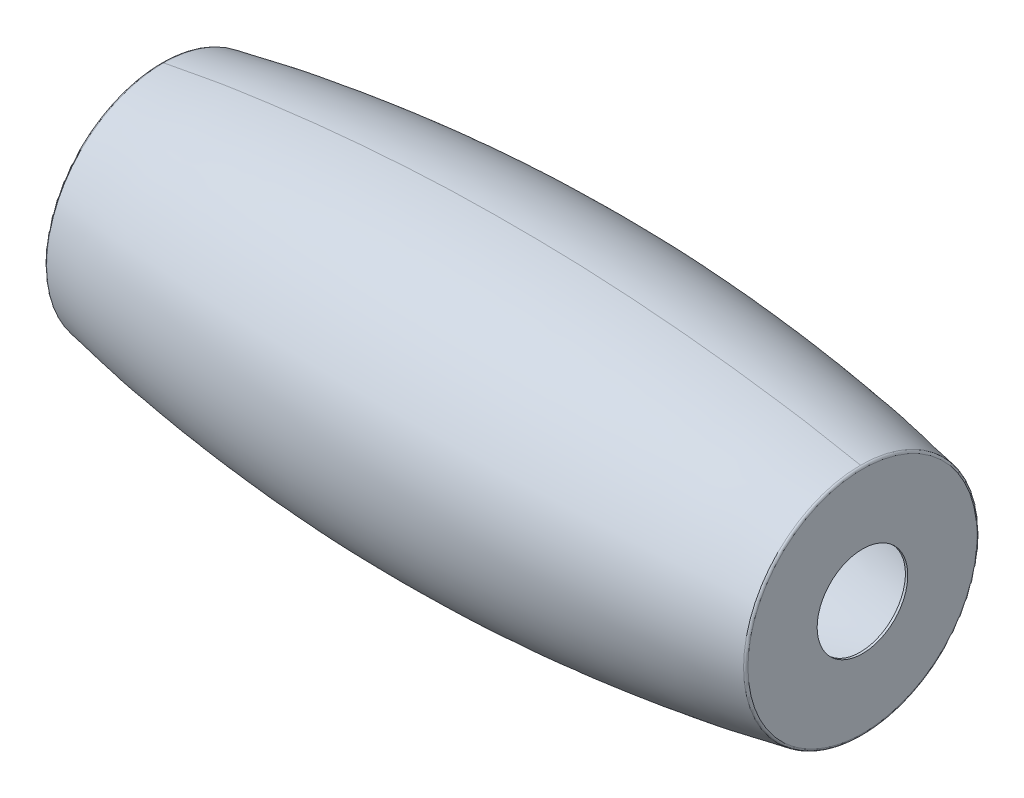
ISO-10303-21;
HEADER;
FILE_DESCRIPTION(('STEP AP214'),'2;1');
FILE_NAME('part.step','',(''),(''),'','','');
FILE_SCHEMA(('AUTOMOTIVE_DESIGN { 1 0 10303 214 1 1 1 1 }'));
ENDSEC;
DATA;
#1=APPLICATION_CONTEXT('core data for automotive mechanical design processes');
#2=APPLICATION_PROTOCOL_DEFINITION('international standard','automotive_design',2000,#1);
#3=PRODUCT_CONTEXT('',#1,'mechanical');
#4=PRODUCT('Part','Part','',(#3));
#5=PRODUCT_RELATED_PRODUCT_CATEGORY('part','',(#4));
#6=PRODUCT_DEFINITION_FORMATION('','',#4);
#7=PRODUCT_DEFINITION_CONTEXT('part definition',#1,'design');
#8=PRODUCT_DEFINITION('design','',#6,#7);
#9=PRODUCT_DEFINITION_SHAPE('','',#8);
#10=(LENGTH_UNIT() NAMED_UNIT(*) SI_UNIT(.MILLI.,.METRE.));
#11=(NAMED_UNIT(*) PLANE_ANGLE_UNIT() SI_UNIT($,.RADIAN.));
#12=(NAMED_UNIT(*) SI_UNIT($,.STERADIAN.) SOLID_ANGLE_UNIT());
#13=UNCERTAINTY_MEASURE_WITH_UNIT(LENGTH_MEASURE(1.E-05),#10,'distance_accuracy_value','');
#14=(GEOMETRIC_REPRESENTATION_CONTEXT(3) GLOBAL_UNCERTAINTY_ASSIGNED_CONTEXT((#13)) GLOBAL_UNIT_ASSIGNED_CONTEXT((#10,
#11,#12)) REPRESENTATION_CONTEXT('',''));
#15=CARTESIAN_POINT('',(0.,0.,0.));
#16=DIRECTION('',(0.,0.,1.));
#17=DIRECTION('',(1.,0.,0.));
#18=AXIS2_PLACEMENT_3D('',#15,#16,#17);
#19=CARTESIAN_POINT('',(36.322,0.,0.));
#20=DIRECTION('',(1.,0.,0.));
#21=DIRECTION('',(0.,1.,0.));
#22=AXIS2_PLACEMENT_3D('',#19,#20,#21);
#23=TOROIDAL_SURFACE('',#22,6.24835214318298,0.254);
#24=CARTESIAN_POINT('',(36.576,0.,0.));
#25=DIRECTION('',(1.,0.,0.));
#26=DIRECTION('',(0.,-1.,0.));
#27=AXIS2_PLACEMENT_3D('',#24,#25,#26);
#28=CIRCLE('',#27,6.24835214318298);
#29=CARTESIAN_POINT('',(36.576,-6.24835214318297,0.));
#30=VERTEX_POINT('',#29);
#31=CARTESIAN_POINT('',(36.576,6.24835214318299,0.));
#32=VERTEX_POINT('',#31);
#33=EDGE_CURVE('E65',#30,#32,#28,.T.);
#34=ORIENTED_EDGE('',*,*,#33,.T.);
#35=CARTESIAN_POINT('',(36.576,0.,0.));
#36=DIRECTION('',(1.,0.,0.));
#37=DIRECTION('',(0.,1.,0.));
#38=AXIS2_PLACEMENT_3D('',#35,#36,#37);
#39=CIRCLE('',#38,6.24835214318298);
#40=EDGE_CURVE('E68',#32,#30,#39,.T.);
#41=ORIENTED_EDGE('',*,*,#40,.T.);
#42=EDGE_LOOP('',(#34,#41));
#43=FACE_BOUND('',#42,.T.);
#44=CARTESIAN_POINT('',(36.404592427617,0.,0.));
#45=DIRECTION('',(1.,0.,0.));
#46=DIRECTION('',(0.,1.,0.));
#47=AXIS2_PLACEMENT_3D('',#44,#45,#46);
#48=CIRCLE('',#47,6.48854891855754);
#49=CARTESIAN_POINT('',(36.404592427617,6.48854891855755,0.));
#50=VERTEX_POINT('',#49);
#51=EDGE_CURVE('E72',#50,#50,#48,.F.);
#52=ORIENTED_EDGE('',*,*,#51,.T.);
#53=EDGE_LOOP('',(#52));
#54=FACE_BOUND('',#53,.T.);
#55=ADVANCED_FACE('F17',(#43,#54),#23,.F.);
#56=CARTESIAN_POINT('',(36.576,0.,0.));
#57=DIRECTION('',(1.,0.,0.));
#58=DIRECTION('',(0.,1.,0.));
#59=AXIS2_PLACEMENT_3D('',#56,#57,#58);
#60=PLANE('',#59);
#61=CARTESIAN_POINT('',(36.576,0.,0.));
#62=DIRECTION('',(-1.,0.,0.));
#63=DIRECTION('',(0.,0.,1.));
#64=AXIS2_PLACEMENT_3D('',#61,#62,#63);
#65=CIRCLE('',#64,4.7625);
#66=CARTESIAN_POINT('',(36.576,0.,4.7625));
#67=VERTEX_POINT('',#66);
#68=EDGE_CURVE('E95',#67,#67,#65,.F.);
#69=ORIENTED_EDGE('',*,*,#68,.T.);
#70=EDGE_LOOP('',(#69));
#71=FACE_BOUND('',#70,.T.);
#72=ORIENTED_EDGE('',*,*,#33,.F.);
#73=ORIENTED_EDGE('',*,*,#40,.F.);
#74=EDGE_LOOP('',(#72,#73));
#75=FACE_BOUND('',#74,.T.);
#76=ADVANCED_FACE('F70',(#71,#75),#60,.F.);
#77=CARTESIAN_POINT('',(-0.761999999999992,-101.6,0.));
#78=DIRECTION('',(0.,0.,1.));
#79=DIRECTION('',(0.,1.,0.));
#80=AXIS2_PLACEMENT_3D('',#77,#78,#79);
#81=CIRCLE('',#80,114.3);
#82=TRIMMED_CURVE('',#81,(PARAMETER_VALUE(-0.475882249660417)),
(PARAMETER_VALUE(0.475882249660417)),.T.,.PARAMETER.);
#83=CARTESIAN_POINT('',(-0.762000000000004,0.,0.));
#84=DIRECTION('',(1.,0.,0.));
#85=AXIS1_PLACEMENT('',#83,#84);
#86=SURFACE_OF_REVOLUTION('',#82,#85);
#87=ORIENTED_EDGE('',*,*,#51,.F.);
#88=EDGE_LOOP('',(#87));
#89=FACE_BOUND('',#88,.T.);
#90=CARTESIAN_POINT('',(-36.83,0.,0.));
#91=DIRECTION('',(1.,0.,0.));
#92=DIRECTION('',(0.,1.,0.));
#93=AXIS2_PLACEMENT_3D('',#90,#91,#92);
#94=CIRCLE('',#93,6.86008194723072);
#95=CARTESIAN_POINT('',(-36.83,6.86008194723071,0.));
#96=VERTEX_POINT('',#95);
#97=EDGE_CURVE('E92',#96,#96,#94,.T.);
#98=ORIENTED_EDGE('',*,*,#97,.F.);
#99=EDGE_LOOP('',(#98));
#100=FACE_BOUND('',#99,.T.);
#101=ADVANCED_FACE('F178',(#89,#100),#86,.T.);
#102=CARTESIAN_POINT('',(38.1,0.,0.));
#103=DIRECTION('',(-1.,0.,0.));
#104=DIRECTION('',(0.,0.,1.));
#105=AXIS2_PLACEMENT_3D('',#102,#103,#104);
#106=CYLINDRICAL_SURFACE('',#105,4.7625);
#107=ORIENTED_EDGE('',*,*,#68,.F.);
#108=EDGE_LOOP('',(#107));
#109=FACE_BOUND('',#108,.T.);
#110=CARTESIAN_POINT('',(36.83,0.,0.));
#111=DIRECTION('',(-1.,0.,0.));
#112=DIRECTION('',(0.,0.,1.));
#113=AXIS2_PLACEMENT_3D('',#110,#111,#112);
#114=CIRCLE('',#113,4.7625);
#115=CARTESIAN_POINT('',(36.83,0.,4.7625));
#116=VERTEX_POINT('',#115);
#117=EDGE_CURVE('E83',#116,#116,#114,.T.);
#118=ORIENTED_EDGE('',*,*,#117,.F.);
#119=EDGE_LOOP('',(#118));
#120=FACE_BOUND('',#119,.T.);
#121=ADVANCED_FACE('F181',(#109,#120),#106,.F.);
#122=CARTESIAN_POINT('',(-36.83,0.,0.));
#123=DIRECTION('',(-1.,0.,0.));
#124=DIRECTION('',(0.,0.,1.));
#125=AXIS2_PLACEMENT_3D('',#122,#123,#124);
#126=PLANE('',#125);
#127=ORIENTED_EDGE('',*,*,#97,.T.);
#128=EDGE_LOOP('',(#127));
#129=FACE_BOUND('',#128,.T.);
#130=CARTESIAN_POINT('',(-36.83,0.,0.));
#131=DIRECTION('',(1.,0.,0.));
#132=DIRECTION('',(0.,0.,-1.));
#133=AXIS2_PLACEMENT_3D('',#130,#131,#132);
#134=CIRCLE('',#133,12.0362964271716);
#135=CARTESIAN_POINT('',(-36.83,0.,-12.0362964271716));
#136=VERTEX_POINT('',#135);
#137=CARTESIAN_POINT('',(-36.83,0.,12.0362964271716));
#138=VERTEX_POINT('',#137);
#139=EDGE_CURVE('E205',#136,#138,#134,.T.);
#140=ORIENTED_EDGE('',*,*,#139,.F.);
#141=CARTESIAN_POINT('',(-36.83,0.,0.));
#142=DIRECTION('',(1.,0.,0.));
#143=DIRECTION('',(0.,0.,1.));
#144=AXIS2_PLACEMENT_3D('',#141,#142,#143);
#145=CIRCLE('',#144,12.0362964271716);
#146=EDGE_CURVE('E169',#138,#136,#145,.T.);
#147=ORIENTED_EDGE('',*,*,#146,.F.);
#148=EDGE_LOOP('',(#140,#147));
#149=FACE_BOUND('',#148,.T.);
#150=ADVANCED_FACE('F201',(#129,#149),#126,.T.);
#151=CARTESIAN_POINT('',(36.83,0.,0.));
#152=DIRECTION('',(1.,0.,0.));
#153=DIRECTION('',(0.,0.,-1.));
#154=AXIS2_PLACEMENT_3D('',#151,#152,#153);
#155=PLANE('',#154);
#156=ORIENTED_EDGE('',*,*,#117,.T.);
#157=EDGE_LOOP('',(#156));
#158=FACE_BOUND('',#157,.T.);
#159=CARTESIAN_POINT('',(36.83,0.,0.));
#160=DIRECTION('',(-1.,0.,0.));
#161=DIRECTION('',(0.,0.,-1.));
#162=AXIS2_PLACEMENT_3D('',#159,#160,#161);
#163=CIRCLE('',#162,12.0362964271716);
#164=CARTESIAN_POINT('',(36.83,0.,-12.0362964271716));
#165=VERTEX_POINT('',#164);
#166=CARTESIAN_POINT('',(36.83,0.,12.0362964271716));
#167=VERTEX_POINT('',#166);
#168=EDGE_CURVE('E135',#165,#167,#163,.T.);
#169=ORIENTED_EDGE('',*,*,#168,.F.);
#170=CARTESIAN_POINT('',(36.83,0.,0.));
#171=DIRECTION('',(-1.,0.,0.));
#172=DIRECTION('',(0.,0.,1.));
#173=AXIS2_PLACEMENT_3D('',#170,#171,#172);
#174=CIRCLE('',#173,12.0362964271716);
#175=EDGE_CURVE('E91',#167,#165,#174,.T.);
#176=ORIENTED_EDGE('',*,*,#175,.F.);
#177=EDGE_LOOP('',(#169,#176));
#178=FACE_BOUND('',#177,.T.);
#179=ADVANCED_FACE('F143',(#158,#178),#155,.T.);
#180=CARTESIAN_POINT('',(-36.576,0.,0.));
#181=DIRECTION('',(-1.,0.,0.));
#182=DIRECTION('',(0.,0.,1.));
#183=AXIS2_PLACEMENT_3D('',#180,#181,#182);
#184=TOROIDAL_SURFACE('',#183,12.0362964271716,0.254);
#185=CARTESIAN_POINT('',(-36.6206256312143,0.,0.));
#186=DIRECTION('',(-1.,0.,0.));
#187=DIRECTION('',(0.,0.,1.));
#188=AXIS2_PLACEMENT_3D('',#185,#186,#187);
#189=CIRCLE('',#188,12.2863455284272);
#190=CARTESIAN_POINT('',(-36.6206256312143,12.2863455284272,0.));
#191=VERTEX_POINT('',#190);
#192=CARTESIAN_POINT('',(-36.6206256312143,-12.2863455284272,0.));
#193=VERTEX_POINT('',#192);
#194=EDGE_CURVE('E29',#191,#193,#189,.T.);
#195=ORIENTED_EDGE('',*,*,#194,.T.);
#196=CARTESIAN_POINT('',(-36.6206256312143,0.,0.));
#197=DIRECTION('',(-1.,0.,0.));
#198=DIRECTION('',(0.,0.,1.));
#199=AXIS2_PLACEMENT_3D('',#196,#197,#198);
#200=CIRCLE('',#199,12.2863455284272);
#201=EDGE_CURVE('E162',#193,#191,#200,.T.);
#202=ORIENTED_EDGE('',*,*,#201,.T.);
#203=EDGE_LOOP('',(#195,#202));
#204=FACE_BOUND('',#203,.T.);
#205=ORIENTED_EDGE('',*,*,#146,.T.);
#206=ORIENTED_EDGE('',*,*,#139,.T.);
#207=EDGE_LOOP('',(#205,#206));
#208=FACE_BOUND('',#207,.T.);
#209=ADVANCED_FACE('F139',(#204,#208),#184,.T.);
#210=CARTESIAN_POINT('',(36.6206256312143,-12.2863455284272,0.));
#211=CARTESIAN_POINT('',(36.6206256312143,-12.2863455284272,24.5726910568543));
#212=CARTESIAN_POINT('',(36.6206256312143,12.2863455284271,24.5726910568543));
#213=CARTESIAN_POINT('',(36.6206256312143,12.2863455284272,0.));
#214=CARTESIAN_POINT('',(36.1823400369662,-12.3645652508626,0.));
#215=CARTESIAN_POINT('',(36.1823400369662,-12.3645652508626,24.7291305017251));
#216=CARTESIAN_POINT('',(36.1823400369662,12.3645652508626,24.7291305017251));
#217=CARTESIAN_POINT('',(36.1823400369662,12.3645652508626,0.));
#218=CARTESIAN_POINT('',(34.895189008316,-12.5919726852556,0.));
#219=CARTESIAN_POINT('',(34.895189008316,-12.5919726852556,25.1839453705113));
#220=CARTESIAN_POINT('',(34.895189008316,12.5919726852556,25.1839453705113));
#221=CARTESIAN_POINT('',(34.895189008316,12.5919726852556,0.));
#222=CARTESIAN_POINT('',(32.7682877990207,-13.0078658125191,0.));
#223=CARTESIAN_POINT('',(32.7682877990207,-13.0078658125191,26.0157316250382));
#224=CARTESIAN_POINT('',(32.7682877990207,13.0078658125191,26.0157316250382));
#225=CARTESIAN_POINT('',(32.7682877990207,13.0078658125191,0.));
#226=CARTESIAN_POINT('',(30.1498936214375,-13.498171470381,0.));
#227=CARTESIAN_POINT('',(30.1498936214375,-13.498171470381,26.996342940762));
#228=CARTESIAN_POINT('',(30.1498936214375,13.498171470381,26.996342940762));
#229=CARTESIAN_POINT('',(30.1498936214375,13.498171470381,0.));
#230=CARTESIAN_POINT('',(27.4652909380355,-13.8563965552137,0.));
#231=CARTESIAN_POINT('',(27.4652909380355,-13.8563965552137,27.7127931104274));
#232=CARTESIAN_POINT('',(27.4652909380355,13.8563965552137,27.7127931104275));
#233=CARTESIAN_POINT('',(27.4652909380355,13.8563965552137,0.));
#234=CARTESIAN_POINT('',(24.7436750485395,-14.262960466835,0.));
#235=CARTESIAN_POINT('',(24.7436750485395,-14.262960466835,28.5259209336699));
#236=CARTESIAN_POINT('',(24.7436750485395,14.262960466835,28.5259209336699));
#237=CARTESIAN_POINT('',(24.7436750485395,14.262960466835,0.));
#238=CARTESIAN_POINT('',(22.0316083077427,-14.5828305626849,0.));
#239=CARTESIAN_POINT('',(22.0316083077427,-14.5828305626849,29.1656611253699));
#240=CARTESIAN_POINT('',(22.0316083077427,14.5828305626849,29.1656611253699));
#241=CARTESIAN_POINT('',(22.0316083077427,14.5828305626849,0.));
#242=CARTESIAN_POINT('',(19.3152565203882,-14.8947163257228,0.));
#243=CARTESIAN_POINT('',(19.3152565203882,-14.8947163257228,29.7894326514455));
#244=CARTESIAN_POINT('',(19.3152565203882,14.8947163257227,29.7894326514455));
#245=CARTESIAN_POINT('',(19.3152565203882,14.8947163257228,0.));
#246=CARTESIAN_POINT('',(16.5786256848154,-15.1399782037662,0.));
#247=CARTESIAN_POINT('',(16.5786256848154,-15.1399782037662,30.2799564075325));
#248=CARTESIAN_POINT('',(16.5786256848154,15.1399782037662,30.2799564075325));
#249=CARTESIAN_POINT('',(16.5786256848154,15.1399782037662,0.));
#250=CARTESIAN_POINT('',(13.8367643124234,-15.3802449571985,0.));
#251=CARTESIAN_POINT('',(13.8367643124234,-15.3802449571985,30.760489914397));
#252=CARTESIAN_POINT('',(13.8367643124234,15.3802449571985,30.760489914397));
#253=CARTESIAN_POINT('',(13.8367643124234,15.3802449571985,0.));
#254=CARTESIAN_POINT('',(11.0749110488003,-15.5453875119554,0.));
#255=CARTESIAN_POINT('',(11.0749110488003,-15.5453875119554,31.0907750239108));
#256=CARTESIAN_POINT('',(11.0749110488003,15.5453875119554,31.0907750239108));
#257=CARTESIAN_POINT('',(11.0749110488003,15.5453875119554,0.));
#258=CARTESIAN_POINT('',(8.30710209974984,-15.7071811580555,0.));
#259=CARTESIAN_POINT('',(8.30710209974984,-15.7071811580555,31.4143623161109));
#260=CARTESIAN_POINT('',(8.30710209974984,15.7071811580554,31.4143623161109));
#261=CARTESIAN_POINT('',(8.30710209974984,15.7071811580555,0.));
#262=CARTESIAN_POINT('',(5.53787452840192,-15.8087833135671,0.));
#263=CARTESIAN_POINT('',(5.53787452840192,-15.8087833135671,31.6175666271341));
#264=CARTESIAN_POINT('',(5.53787452840192,15.8087833135671,31.6175666271341));
#265=CARTESIAN_POINT('',(5.53787452840192,15.8087833135671,0.));
#266=CARTESIAN_POINT('',(2.76875168423245,-15.8503711155309,0.));
#267=CARTESIAN_POINT('',(2.76875168423245,-15.8503711155309,31.7007422310617));
#268=CARTESIAN_POINT('',(2.76875168423245,15.8503711155309,31.7007422310617));
#269=CARTESIAN_POINT('',(2.76875168423245,15.8503711155309,0.));
#270=CARTESIAN_POINT('',(0.,-15.8873136650366,0.));
#271=CARTESIAN_POINT('',(0.,-15.8873136650366,31.7746273300733));
#272=CARTESIAN_POINT('',(0.,15.8873136650366,31.7746273300733));
#273=CARTESIAN_POINT('',(0.,15.8873136650366,0.));
#274=CARTESIAN_POINT('',(-2.76875168423244,-15.8503711155309,0.));
#275=CARTESIAN_POINT('',(-2.76875168423244,-15.8503711155309,31.7007422310617));
#276=CARTESIAN_POINT('',(-2.76875168423244,15.8503711155309,31.7007422310617));
#277=CARTESIAN_POINT('',(-2.76875168423244,15.8503711155309,0.));
#278=CARTESIAN_POINT('',(-5.53787452840193,-15.8087833135671,0.));
#279=CARTESIAN_POINT('',(-5.53787452840193,-15.8087833135671,31.6175666271341));
#280=CARTESIAN_POINT('',(-5.53787452840193,15.8087833135671,31.6175666271341));
#281=CARTESIAN_POINT('',(-5.53787452840193,15.8087833135671,0.));
#282=CARTESIAN_POINT('',(-8.30710209974984,-15.7071811580555,0.));
#283=CARTESIAN_POINT('',(-8.30710209974984,-15.7071811580555,31.4143623161109));
#284=CARTESIAN_POINT('',(-8.30710209974984,15.7071811580554,31.4143623161109));
#285=CARTESIAN_POINT('',(-8.30710209974984,15.7071811580555,0.));
#286=CARTESIAN_POINT('',(-11.0749110488003,-15.5453875119554,0.));
#287=CARTESIAN_POINT('',(-11.0749110488003,-15.5453875119554,31.0907750239108));
#288=CARTESIAN_POINT('',(-11.0749110488003,15.5453875119554,31.0907750239108));
#289=CARTESIAN_POINT('',(-11.0749110488003,15.5453875119554,0.));
#290=CARTESIAN_POINT('',(-13.8367643124234,-15.3802449571985,0.));
#291=CARTESIAN_POINT('',(-13.8367643124234,-15.3802449571985,30.760489914397));
#292=CARTESIAN_POINT('',(-13.8367643124234,15.3802449571985,30.760489914397));
#293=CARTESIAN_POINT('',(-13.8367643124234,15.3802449571985,0.));
#294=CARTESIAN_POINT('',(-16.5786256848154,-15.1399782037662,0.));
#295=CARTESIAN_POINT('',(-16.5786256848154,-15.1399782037663,30.2799564075325));
#296=CARTESIAN_POINT('',(-16.5786256848154,15.1399782037662,30.2799564075325));
#297=CARTESIAN_POINT('',(-16.5786256848154,15.1399782037662,0.));
#298=CARTESIAN_POINT('',(-19.3152565203882,-14.8947163257228,0.));
#299=CARTESIAN_POINT('',(-19.3152565203882,-14.8947163257228,29.7894326514455));
#300=CARTESIAN_POINT('',(-19.3152565203882,14.8947163257227,29.7894326514455));
#301=CARTESIAN_POINT('',(-19.3152565203882,14.8947163257228,0.));
#302=CARTESIAN_POINT('',(-22.0316083077427,-14.5828305626849,0.));
#303=CARTESIAN_POINT('',(-22.0316083077427,-14.5828305626849,29.1656611253699));
#304=CARTESIAN_POINT('',(-22.0316083077427,14.5828305626849,29.1656611253699));
#305=CARTESIAN_POINT('',(-22.0316083077427,14.5828305626849,0.));
#306=CARTESIAN_POINT('',(-24.7436750485395,-14.262960466835,0.));
#307=CARTESIAN_POINT('',(-24.7436750485395,-14.262960466835,28.5259209336699));
#308=CARTESIAN_POINT('',(-24.7436750485395,14.2629604668349,28.5259209336699));
#309=CARTESIAN_POINT('',(-24.7436750485395,14.262960466835,0.));
#310=CARTESIAN_POINT('',(-27.4652909380355,-13.8563965552137,0.));
#311=CARTESIAN_POINT('',(-27.4652909380355,-13.8563965552137,27.7127931104275));
#312=CARTESIAN_POINT('',(-27.4652909380355,13.8563965552137,27.7127931104275));
#313=CARTESIAN_POINT('',(-27.4652909380355,13.8563965552137,0.));
#314=CARTESIAN_POINT('',(-30.1498936214375,-13.498171470381,0.));
#315=CARTESIAN_POINT('',(-30.1498936214375,-13.498171470381,26.996342940762));
#316=CARTESIAN_POINT('',(-30.1498936214375,13.498171470381,26.996342940762));
#317=CARTESIAN_POINT('',(-30.1498936214375,13.498171470381,0.));
#318=CARTESIAN_POINT('',(-32.7682877990207,-13.0078658125191,0.));
#319=CARTESIAN_POINT('',(-32.7682877990207,-13.0078658125191,26.0157316250382));
#320=CARTESIAN_POINT('',(-32.7682877990207,13.0078658125191,26.0157316250382));
#321=CARTESIAN_POINT('',(-32.7682877990207,13.0078658125191,0.));
#322=CARTESIAN_POINT('',(-34.895189008316,-12.5919726852557,0.));
#323=CARTESIAN_POINT('',(-34.895189008316,-12.5919726852557,25.1839453705113));
#324=CARTESIAN_POINT('',(-34.895189008316,12.5919726852556,25.1839453705113));
#325=CARTESIAN_POINT('',(-34.895189008316,12.5919726852557,0.));
#326=CARTESIAN_POINT('',(-36.1823400369662,-12.3645652508626,0.));
#327=CARTESIAN_POINT('',(-36.1823400369662,-12.3645652508626,24.7291305017251));
#328=CARTESIAN_POINT('',(-36.1823400369662,12.3645652508626,24.7291305017251));
#329=CARTESIAN_POINT('',(-36.1823400369662,12.3645652508626,0.));
#330=CARTESIAN_POINT('',(-36.6206256312143,-12.2863455284272,0.));
#331=CARTESIAN_POINT('',(-36.6206256312143,-12.2863455284272,24.5726910568543));
#332=CARTESIAN_POINT('',(-36.6206256312143,12.2863455284271,24.5726910568543));
#333=CARTESIAN_POINT('',(-36.6206256312143,12.2863455284272,0.));
#334=(BOUNDED_SURFACE() B_SPLINE_SURFACE(3,3,((#210,#211,#212,#213),(#214,#215,#216,#217),(#218,
#219,#220,#221),(#222,#223,#224,#225),(#226,#227,#228,#229),(#230,#231,#232,#233),(#234,#235,
#236,#237),(#238,#239,#240,#241),(#242,#243,#244,#245),(#246,#247,#248,#249),(#250,#251,#252,
#253),(#254,#255,#256,#257),(#258,#259,#260,#261),(#262,#263,#264,#265),(#266,#267,#268,#269),
(#270,#271,#272,#273),(#274,#275,#276,#277),(#278,#279,#280,#281),(#282,#283,#284,#285),(#286,
#287,#288,#289),(#290,#291,#292,#293),(#294,#295,#296,#297),(#298,#299,#300,#301),(#302,#303,
#304,#305),(#306,#307,#308,#309),(#310,#311,#312,#313),(#314,#315,#316,#317),(#318,#319,#320,
#321),(#322,#323,#324,#325),(#326,#327,#328,#329),(#330,#331,#332,#333)),.UNSPECIFIED.,.F.,.F.,
.F.) B_SPLINE_SURFACE_WITH_KNOTS((4,1,1,1,1,1,1,1,1,1,1,1,1,1,1,1,1,1,1,1,1,1,1,1,1,1,1,1,4),(4,
4),(0.265284915948771,0.273790766766706,0.290256508761379,0.30669282418853,0.324674055134799,
0.34199181548783,0.35926721557039,0.376845182434682,0.394229300381297,0.411760312088999,
0.429428853188004,0.447087765048057,0.464731852432814,0.482367039150761,0.5,0.517632960849239,
0.535268147567186,0.552912234951943,0.570571146811996,0.588239687911001,0.605770699618703,
0.623154817565318,0.64073278442961,0.65800818451217,0.675325944865201,0.693307175811471,
0.709743491238622,0.726209233233295,0.734715084051229),(0.,1.),
.UNSPECIFIED.) GEOMETRIC_REPRESENTATION_ITEM() RATIONAL_B_SPLINE_SURFACE(((1.,0.333333333333333,
0.333333333333333,1.),(1.,0.333333333333333,0.333333333333333,1.),(1.,0.333333333333333,
0.333333333333333,1.),(1.,0.333333333333333,0.333333333333333,1.),(1.,0.333333333333333,
0.333333333333333,1.),(1.,0.333333333333333,0.333333333333333,1.),(1.,0.333333333333333,
0.333333333333333,1.),(1.,0.333333333333333,0.333333333333333,1.),(1.,0.333333333333333,
0.333333333333333,1.),(1.,0.333333333333333,0.333333333333333,1.),(1.,0.333333333333333,
0.333333333333333,1.),(1.,0.333333333333333,0.333333333333333,1.),(1.,0.333333333333333,
0.333333333333333,1.),(1.,0.333333333333333,0.333333333333333,1.),(1.,0.333333333333333,
0.333333333333333,1.),(1.,0.333333333333333,0.333333333333333,1.),(1.,0.333333333333333,
0.333333333333333,1.),(1.,0.333333333333333,0.333333333333333,1.),(1.,0.333333333333333,
0.333333333333333,1.),(1.,0.333333333333333,0.333333333333333,1.),(1.,0.333333333333333,
0.333333333333333,1.),(1.,0.333333333333333,0.333333333333333,1.),(1.,0.333333333333333,
0.333333333333333,1.),(1.,0.333333333333333,0.333333333333333,1.),(1.,0.333333333333333,
0.333333333333333,1.),(1.,0.333333333333333,0.333333333333333,1.),(1.,0.333333333333333,
0.333333333333333,1.),(1.,0.333333333333333,0.333333333333333,1.),(1.,0.333333333333333,
0.333333333333333,1.),(1.,0.333333333333333,0.333333333333333,1.),(1.,0.333333333333333,
0.333333333333333,1.))) REPRESENTATION_ITEM('') SURFACE());
#335=CARTESIAN_POINT('',(36.6206256312143,0.,0.));
#336=DIRECTION('',(-1.,0.,0.));
#337=DIRECTION('',(0.,0.,1.));
#338=AXIS2_PLACEMENT_3D('',#335,#336,#337);
#339=CIRCLE('',#338,12.2863455284272);
#340=CARTESIAN_POINT('',(36.6206256312143,12.2863455284272,0.));
#341=VERTEX_POINT('',#340);
#342=CARTESIAN_POINT('',(36.6206256312143,-12.2863455284272,0.));
#343=VERTEX_POINT('',#342);
#344=EDGE_CURVE('E133',#341,#343,#339,.F.);
#345=CARTESIAN_POINT('',(36.6206256312143,12.2863455284272,0.));
#346=CARTESIAN_POINT('',(36.1823400369662,12.3645652508626,0.));
#347=CARTESIAN_POINT('',(34.895189008316,12.5919726852556,0.));
#348=CARTESIAN_POINT('',(32.7682877990207,13.0078658125191,0.));
#349=CARTESIAN_POINT('',(30.1498936214375,13.498171470381,0.));
#350=CARTESIAN_POINT('',(27.4652909380355,13.8563965552137,0.));
#351=CARTESIAN_POINT('',(24.7436750485395,14.262960466835,0.));
#352=CARTESIAN_POINT('',(22.0316083077427,14.5828305626849,0.));
#353=CARTESIAN_POINT('',(19.3152565203882,14.8947163257228,0.));
#354=CARTESIAN_POINT('',(16.5786256848154,15.1399782037662,0.));
#355=CARTESIAN_POINT('',(13.8367643124234,15.3802449571985,0.));
#356=CARTESIAN_POINT('',(11.0749110488003,15.5453875119554,0.));
#357=CARTESIAN_POINT('',(8.30710209974984,15.7071811580555,0.));
#358=CARTESIAN_POINT('',(5.53787452840192,15.8087833135671,0.));
#359=CARTESIAN_POINT('',(2.76875168423245,15.8503711155309,0.));
#360=CARTESIAN_POINT('',(0.,15.8873136650366,0.));
#361=CARTESIAN_POINT('',(-2.76875168423244,15.8503711155309,0.));
#362=CARTESIAN_POINT('',(-5.53787452840193,15.8087833135671,0.));
#363=CARTESIAN_POINT('',(-8.30710209974984,15.7071811580555,0.));
#364=CARTESIAN_POINT('',(-11.0749110488003,15.5453875119554,0.));
#365=CARTESIAN_POINT('',(-13.8367643124234,15.3802449571985,0.));
#366=CARTESIAN_POINT('',(-16.5786256848154,15.1399782037662,0.));
#367=CARTESIAN_POINT('',(-19.3152565203882,14.8947163257228,0.));
#368=CARTESIAN_POINT('',(-22.0316083077427,14.5828305626849,0.));
#369=CARTESIAN_POINT('',(-24.7436750485395,14.262960466835,0.));
#370=CARTESIAN_POINT('',(-27.4652909380355,13.8563965552137,0.));
#371=CARTESIAN_POINT('',(-30.1498936214375,13.498171470381,0.));
#372=CARTESIAN_POINT('',(-32.7682877990207,13.0078658125191,0.));
#373=CARTESIAN_POINT('',(-34.895189008316,12.5919726852557,0.));
#374=CARTESIAN_POINT('',(-36.1823400369662,12.3645652508626,0.));
#375=CARTESIAN_POINT('',(-36.6206256312143,12.2863455284272,0.));
#376=B_SPLINE_CURVE_WITH_KNOTS('',3,(#345,#346,#347,#348,#349,#350,#351,#352,#353,#354,#355,
#356,#357,#358,#359,#360,#361,#362,#363,#364,#365,#366,#367,#368,#369,#370,#371,#372,#373,#374,
#375),.UNSPECIFIED.,.F.,.F.,(4,1,1,1,1,1,1,1,1,1,1,1,1,1,1,1,1,1,1,1,1,1,1,1,1,1,1,1,4),
(0.265284915948771,0.273790766766706,0.290256508761379,0.30669282418853,0.324674055134799,
0.34199181548783,0.35926721557039,0.376845182434682,0.394229300381297,0.411760312088999,
0.429428853188004,0.447087765048057,0.464731852432814,0.482367039150761,0.5,0.517632960849239,
0.535268147567186,0.552912234951943,0.570571146811996,0.588239687911001,0.605770699618703,
0.623154817565318,0.64073278442961,0.65800818451217,0.675325944865201,0.693307175811471,
0.709743491238622,0.726209233233295,0.734715084051229),.UNSPECIFIED.);
#377=EDGE_CURVE('E130',#341,#191,#376,.T.);
#378=CARTESIAN_POINT('',(36.6206256312143,-12.2863455284272,0.));
#379=CARTESIAN_POINT('',(36.1823400369662,-12.3645652508626,0.));
#380=CARTESIAN_POINT('',(34.895189008316,-12.5919726852556,0.));
#381=CARTESIAN_POINT('',(32.7682877990207,-13.0078658125191,0.));
#382=CARTESIAN_POINT('',(30.1498936214375,-13.498171470381,0.));
#383=CARTESIAN_POINT('',(27.4652909380355,-13.8563965552137,0.));
#384=CARTESIAN_POINT('',(24.7436750485395,-14.262960466835,0.));
#385=CARTESIAN_POINT('',(22.0316083077427,-14.5828305626849,0.));
#386=CARTESIAN_POINT('',(19.3152565203882,-14.8947163257228,0.));
#387=CARTESIAN_POINT('',(16.5786256848154,-15.1399782037662,0.));
#388=CARTESIAN_POINT('',(13.8367643124234,-15.3802449571985,0.));
#389=CARTESIAN_POINT('',(11.0749110488003,-15.5453875119554,0.));
#390=CARTESIAN_POINT('',(8.30710209974984,-15.7071811580555,0.));
#391=CARTESIAN_POINT('',(5.53787452840192,-15.8087833135671,0.));
#392=CARTESIAN_POINT('',(2.76875168423245,-15.8503711155309,0.));
#393=CARTESIAN_POINT('',(0.,-15.8873136650366,0.));
#394=CARTESIAN_POINT('',(-2.76875168423244,-15.8503711155309,0.));
#395=CARTESIAN_POINT('',(-5.53787452840193,-15.8087833135671,0.));
#396=CARTESIAN_POINT('',(-8.30710209974984,-15.7071811580555,0.));
#397=CARTESIAN_POINT('',(-11.0749110488003,-15.5453875119554,0.));
#398=CARTESIAN_POINT('',(-13.8367643124234,-15.3802449571985,0.));
#399=CARTESIAN_POINT('',(-16.5786256848154,-15.1399782037662,0.));
#400=CARTESIAN_POINT('',(-19.3152565203882,-14.8947163257228,0.));
#401=CARTESIAN_POINT('',(-22.0316083077427,-14.5828305626849,0.));
#402=CARTESIAN_POINT('',(-24.7436750485395,-14.262960466835,0.));
#403=CARTESIAN_POINT('',(-27.4652909380355,-13.8563965552137,0.));
#404=CARTESIAN_POINT('',(-30.1498936214375,-13.498171470381,0.));
#405=CARTESIAN_POINT('',(-32.7682877990207,-13.0078658125191,0.));
#406=CARTESIAN_POINT('',(-34.895189008316,-12.5919726852557,0.));
#407=CARTESIAN_POINT('',(-36.1823400369662,-12.3645652508626,0.));
#408=CARTESIAN_POINT('',(-36.6206256312143,-12.2863455284272,0.));
#409=B_SPLINE_CURVE_WITH_KNOTS('',3,(#378,#379,#380,#381,#382,#383,#384,#385,#386,#387,#388,
#389,#390,#391,#392,#393,#394,#395,#396,#397,#398,#399,#400,#401,#402,#403,#404,#405,#406,#407,
#408),.UNSPECIFIED.,.F.,.F.,(4,1,1,1,1,1,1,1,1,1,1,1,1,1,1,1,1,1,1,1,1,1,1,1,1,1,1,1,4),
(0.265284915948771,0.273790766766706,0.290256508761379,0.30669282418853,0.324674055134799,
0.34199181548783,0.35926721557039,0.376845182434682,0.394229300381297,0.411760312088999,
0.429428853188004,0.447087765048057,0.464731852432814,0.482367039150761,0.5,0.517632960849239,
0.535268147567186,0.552912234951943,0.570571146811996,0.588239687911001,0.605770699618703,
0.623154817565318,0.64073278442961,0.65800818451217,0.675325944865201,0.693307175811471,
0.709743491238622,0.726209233233295,0.734715084051229),.UNSPECIFIED.);
#410=EDGE_CURVE('E11',#193,#343,#409,.F.);
#411=ORIENTED_EDGE('',*,*,#344,.F.);
#412=ORIENTED_EDGE('',*,*,#377,.T.);
#413=ORIENTED_EDGE('',*,*,#201,.F.);
#414=ORIENTED_EDGE('',*,*,#410,.T.);
#415=EDGE_LOOP('',(#411,#412,#413,#414));
#416=FACE_BOUND('',#415,.T.);
#417=ADVANCED_FACE('F119',(#416),#334,.F.);
#418=CARTESIAN_POINT('',(36.576,0.,0.));
#419=DIRECTION('',(-1.,0.,0.));
#420=DIRECTION('',(0.,0.,1.));
#421=AXIS2_PLACEMENT_3D('',#418,#419,#420);
#422=TOROIDAL_SURFACE('',#421,12.0362964271716,0.254);
#423=ORIENTED_EDGE('',*,*,#175,.T.);
#424=ORIENTED_EDGE('',*,*,#168,.T.);
#425=EDGE_LOOP('',(#423,#424));
#426=FACE_BOUND('',#425,.T.);
#427=ORIENTED_EDGE('',*,*,#344,.T.);
#428=CARTESIAN_POINT('',(36.6206256312143,0.,0.));
#429=DIRECTION('',(1.,0.,0.));
#430=DIRECTION('',(0.,0.,-1.));
#431=AXIS2_PLACEMENT_3D('',#428,#429,#430);
#432=CIRCLE('',#431,12.2863455284272);
#433=EDGE_CURVE('E38',#343,#341,#432,.T.);
#434=ORIENTED_EDGE('',*,*,#433,.T.);
#435=EDGE_LOOP('',(#427,#434));
#436=FACE_BOUND('',#435,.T.);
#437=ADVANCED_FACE('F107',(#426,#436),#422,.T.);
#438=CARTESIAN_POINT('',(36.6206256312143,12.2863455284272,0.));
#439=CARTESIAN_POINT('',(36.6206256312143,12.2863455284272,-24.5726910568543));
#440=CARTESIAN_POINT('',(36.6206256312143,-12.2863455284271,-24.5726910568543));
#441=CARTESIAN_POINT('',(36.6206256312143,-12.2863455284272,0.));
#442=CARTESIAN_POINT('',(36.1823400369662,12.3645652508626,0.));
#443=CARTESIAN_POINT('',(36.1823400369662,12.3645652508626,-24.7291305017251));
#444=CARTESIAN_POINT('',(36.1823400369662,-12.3645652508626,-24.7291305017251));
#445=CARTESIAN_POINT('',(36.1823400369662,-12.3645652508626,0.));
#446=CARTESIAN_POINT('',(34.895189008316,12.5919726852556,0.));
#447=CARTESIAN_POINT('',(34.895189008316,12.5919726852556,-25.1839453705113));
#448=CARTESIAN_POINT('',(34.895189008316,-12.5919726852556,-25.1839453705113));
#449=CARTESIAN_POINT('',(34.895189008316,-12.5919726852556,0.));
#450=CARTESIAN_POINT('',(32.7682877990207,13.0078658125191,0.));
#451=CARTESIAN_POINT('',(32.7682877990207,13.0078658125191,-26.0157316250382));
#452=CARTESIAN_POINT('',(32.7682877990207,-13.0078658125191,-26.0157316250382));
#453=CARTESIAN_POINT('',(32.7682877990207,-13.0078658125191,0.));
#454=CARTESIAN_POINT('',(30.1498936214375,13.498171470381,0.));
#455=CARTESIAN_POINT('',(30.1498936214375,13.498171470381,-26.996342940762));
#456=CARTESIAN_POINT('',(30.1498936214375,-13.498171470381,-26.996342940762));
#457=CARTESIAN_POINT('',(30.1498936214375,-13.498171470381,0.));
#458=CARTESIAN_POINT('',(27.4652909380355,13.8563965552137,0.));
#459=CARTESIAN_POINT('',(27.4652909380355,13.8563965552137,-27.7127931104274));
#460=CARTESIAN_POINT('',(27.4652909380355,-13.8563965552137,-27.7127931104274));
#461=CARTESIAN_POINT('',(27.4652909380355,-13.8563965552137,0.));
#462=CARTESIAN_POINT('',(24.7436750485395,14.262960466835,0.));
#463=CARTESIAN_POINT('',(24.7436750485395,14.262960466835,-28.5259209336699));
#464=CARTESIAN_POINT('',(24.7436750485395,-14.262960466835,-28.5259209336699));
#465=CARTESIAN_POINT('',(24.7436750485395,-14.262960466835,0.));
#466=CARTESIAN_POINT('',(22.0316083077427,14.5828305626849,0.));
#467=CARTESIAN_POINT('',(22.0316083077427,14.5828305626849,-29.1656611253699));
#468=CARTESIAN_POINT('',(22.0316083077427,-14.5828305626849,-29.1656611253699));
#469=CARTESIAN_POINT('',(22.0316083077427,-14.5828305626849,0.));
#470=CARTESIAN_POINT('',(19.3152565203882,14.8947163257228,0.));
#471=CARTESIAN_POINT('',(19.3152565203882,14.8947163257228,-29.7894326514455));
#472=CARTESIAN_POINT('',(19.3152565203882,-14.8947163257227,-29.7894326514455));
#473=CARTESIAN_POINT('',(19.3152565203882,-14.8947163257228,0.));
#474=CARTESIAN_POINT('',(16.5786256848154,15.1399782037662,0.));
#475=CARTESIAN_POINT('',(16.5786256848154,15.1399782037662,-30.2799564075325));
#476=CARTESIAN_POINT('',(16.5786256848154,-15.1399782037662,-30.2799564075325));
#477=CARTESIAN_POINT('',(16.5786256848154,-15.1399782037662,0.));
#478=CARTESIAN_POINT('',(13.8367643124234,15.3802449571985,0.));
#479=CARTESIAN_POINT('',(13.8367643124234,15.3802449571985,-30.760489914397));
#480=CARTESIAN_POINT('',(13.8367643124234,-15.3802449571985,-30.760489914397));
#481=CARTESIAN_POINT('',(13.8367643124234,-15.3802449571985,0.));
#482=CARTESIAN_POINT('',(11.0749110488003,15.5453875119554,0.));
#483=CARTESIAN_POINT('',(11.0749110488003,15.5453875119554,-31.0907750239108));
#484=CARTESIAN_POINT('',(11.0749110488003,-15.5453875119554,-31.0907750239108));
#485=CARTESIAN_POINT('',(11.0749110488003,-15.5453875119554,0.));
#486=CARTESIAN_POINT('',(8.30710209974984,15.7071811580555,0.));
#487=CARTESIAN_POINT('',(8.30710209974984,15.7071811580555,-31.4143623161109));
#488=CARTESIAN_POINT('',(8.30710209974984,-15.7071811580554,-31.4143623161109));
#489=CARTESIAN_POINT('',(8.30710209974984,-15.7071811580555,0.));
#490=CARTESIAN_POINT('',(5.53787452840192,15.8087833135671,0.));
#491=CARTESIAN_POINT('',(5.53787452840192,15.8087833135671,-31.6175666271341));
#492=CARTESIAN_POINT('',(5.53787452840192,-15.8087833135671,-31.6175666271341));
#493=CARTESIAN_POINT('',(5.53787452840192,-15.8087833135671,0.));
#494=CARTESIAN_POINT('',(2.76875168423245,15.8503711155309,0.));
#495=CARTESIAN_POINT('',(2.76875168423245,15.8503711155309,-31.7007422310617));
#496=CARTESIAN_POINT('',(2.76875168423245,-15.8503711155309,-31.7007422310617));
#497=CARTESIAN_POINT('',(2.76875168423245,-15.8503711155309,0.));
#498=CARTESIAN_POINT('',(0.,15.8873136650366,0.));
#499=CARTESIAN_POINT('',(0.,15.8873136650366,-31.7746273300733));
#500=CARTESIAN_POINT('',(0.,-15.8873136650366,-31.7746273300733));
#501=CARTESIAN_POINT('',(0.,-15.8873136650366,0.));
#502=CARTESIAN_POINT('',(-2.76875168423244,15.8503711155309,0.));
#503=CARTESIAN_POINT('',(-2.76875168423244,15.8503711155309,-31.7007422310617));
#504=CARTESIAN_POINT('',(-2.76875168423244,-15.8503711155309,-31.7007422310617));
#505=CARTESIAN_POINT('',(-2.76875168423244,-15.8503711155309,0.));
#506=CARTESIAN_POINT('',(-5.53787452840193,15.8087833135671,0.));
#507=CARTESIAN_POINT('',(-5.53787452840193,15.8087833135671,-31.6175666271341));
#508=CARTESIAN_POINT('',(-5.53787452840193,-15.8087833135671,-31.6175666271341));
#509=CARTESIAN_POINT('',(-5.53787452840193,-15.8087833135671,0.));
#510=CARTESIAN_POINT('',(-8.30710209974984,15.7071811580555,0.));
#511=CARTESIAN_POINT('',(-8.30710209974984,15.7071811580555,-31.4143623161109));
#512=CARTESIAN_POINT('',(-8.30710209974984,-15.7071811580555,-31.4143623161109));
#513=CARTESIAN_POINT('',(-8.30710209974984,-15.7071811580555,0.));
#514=CARTESIAN_POINT('',(-11.0749110488003,15.5453875119554,0.));
#515=CARTESIAN_POINT('',(-11.0749110488003,15.5453875119554,-31.0907750239108));
#516=CARTESIAN_POINT('',(-11.0749110488003,-15.5453875119554,-31.0907750239108));
#517=CARTESIAN_POINT('',(-11.0749110488003,-15.5453875119554,0.));
#518=CARTESIAN_POINT('',(-13.8367643124234,15.3802449571985,0.));
#519=CARTESIAN_POINT('',(-13.8367643124234,15.3802449571985,-30.760489914397));
#520=CARTESIAN_POINT('',(-13.8367643124234,-15.3802449571985,-30.760489914397));
#521=CARTESIAN_POINT('',(-13.8367643124234,-15.3802449571985,0.));
#522=CARTESIAN_POINT('',(-16.5786256848154,15.1399782037662,0.));
#523=CARTESIAN_POINT('',(-16.5786256848154,15.1399782037662,-30.2799564075325));
#524=CARTESIAN_POINT('',(-16.5786256848154,-15.1399782037662,-30.2799564075325));
#525=CARTESIAN_POINT('',(-16.5786256848154,-15.1399782037662,0.));
#526=CARTESIAN_POINT('',(-19.3152565203882,14.8947163257228,0.));
#527=CARTESIAN_POINT('',(-19.3152565203882,14.8947163257228,-29.7894326514455));
#528=CARTESIAN_POINT('',(-19.3152565203882,-14.8947163257228,-29.7894326514455));
#529=CARTESIAN_POINT('',(-19.3152565203882,-14.8947163257228,0.));
#530=CARTESIAN_POINT('',(-22.0316083077427,14.5828305626849,0.));
#531=CARTESIAN_POINT('',(-22.0316083077427,14.5828305626849,-29.1656611253699));
#532=CARTESIAN_POINT('',(-22.0316083077427,-14.5828305626849,-29.1656611253699));
#533=CARTESIAN_POINT('',(-22.0316083077427,-14.5828305626849,0.));
#534=CARTESIAN_POINT('',(-24.7436750485395,14.262960466835,0.));
#535=CARTESIAN_POINT('',(-24.7436750485395,14.262960466835,-28.5259209336699));
#536=CARTESIAN_POINT('',(-24.7436750485395,-14.262960466835,-28.5259209336699));
#537=CARTESIAN_POINT('',(-24.7436750485395,-14.262960466835,0.));
#538=CARTESIAN_POINT('',(-27.4652909380355,13.8563965552137,0.));
#539=CARTESIAN_POINT('',(-27.4652909380355,13.8563965552137,-27.7127931104275));
#540=CARTESIAN_POINT('',(-27.4652909380355,-13.8563965552137,-27.7127931104275));
#541=CARTESIAN_POINT('',(-27.4652909380355,-13.8563965552137,0.));
#542=CARTESIAN_POINT('',(-30.1498936214375,13.498171470381,0.));
#543=CARTESIAN_POINT('',(-30.1498936214375,13.498171470381,-26.996342940762));
#544=CARTESIAN_POINT('',(-30.1498936214375,-13.498171470381,-26.996342940762));
#545=CARTESIAN_POINT('',(-30.1498936214375,-13.498171470381,0.));
#546=CARTESIAN_POINT('',(-32.7682877990207,13.0078658125191,0.));
#547=CARTESIAN_POINT('',(-32.7682877990207,13.0078658125191,-26.0157316250382));
#548=CARTESIAN_POINT('',(-32.7682877990207,-13.0078658125191,-26.0157316250382));
#549=CARTESIAN_POINT('',(-32.7682877990207,-13.0078658125191,0.));
#550=CARTESIAN_POINT('',(-34.895189008316,12.5919726852557,0.));
#551=CARTESIAN_POINT('',(-34.895189008316,12.5919726852557,-25.1839453705113));
#552=CARTESIAN_POINT('',(-34.895189008316,-12.5919726852556,-25.1839453705113));
#553=CARTESIAN_POINT('',(-34.895189008316,-12.5919726852557,0.));
#554=CARTESIAN_POINT('',(-36.1823400369662,12.3645652508626,0.));
#555=CARTESIAN_POINT('',(-36.1823400369662,12.3645652508626,-24.7291305017251));
#556=CARTESIAN_POINT('',(-36.1823400369662,-12.3645652508626,-24.7291305017251));
#557=CARTESIAN_POINT('',(-36.1823400369662,-12.3645652508626,0.));
#558=CARTESIAN_POINT('',(-36.6206256312143,12.2863455284272,0.));
#559=CARTESIAN_POINT('',(-36.6206256312143,12.2863455284272,-24.5726910568543));
#560=CARTESIAN_POINT('',(-36.6206256312143,-12.2863455284271,-24.5726910568543));
#561=CARTESIAN_POINT('',(-36.6206256312143,-12.2863455284272,0.));
#562=(BOUNDED_SURFACE() B_SPLINE_SURFACE(3,3,((#438,#439,#440,#441),(#442,#443,#444,#445),(#446,
#447,#448,#449),(#450,#451,#452,#453),(#454,#455,#456,#457),(#458,#459,#460,#461),(#462,#463,
#464,#465),(#466,#467,#468,#469),(#470,#471,#472,#473),(#474,#475,#476,#477),(#478,#479,#480,
#481),(#482,#483,#484,#485),(#486,#487,#488,#489),(#490,#491,#492,#493),(#494,#495,#496,#497),
(#498,#499,#500,#501),(#502,#503,#504,#505),(#506,#507,#508,#509),(#510,#511,#512,#513),(#514,
#515,#516,#517),(#518,#519,#520,#521),(#522,#523,#524,#525),(#526,#527,#528,#529),(#530,#531,
#532,#533),(#534,#535,#536,#537),(#538,#539,#540,#541),(#542,#543,#544,#545),(#546,#547,#548,
#549),(#550,#551,#552,#553),(#554,#555,#556,#557),(#558,#559,#560,#561)),.UNSPECIFIED.,.F.,.F.,
.F.) B_SPLINE_SURFACE_WITH_KNOTS((4,1,1,1,1,1,1,1,1,1,1,1,1,1,1,1,1,1,1,1,1,1,1,1,1,1,1,1,4),(4,
4),(0.265284915948771,0.273790766766706,0.290256508761379,0.30669282418853,0.324674055134799,
0.34199181548783,0.35926721557039,0.376845182434682,0.394229300381297,0.411760312088999,
0.429428853188004,0.447087765048057,0.464731852432814,0.482367039150761,0.5,0.517632960849239,
0.535268147567186,0.552912234951943,0.570571146811996,0.588239687911001,0.605770699618703,
0.623154817565318,0.64073278442961,0.65800818451217,0.675325944865201,0.693307175811471,
0.709743491238622,0.726209233233295,0.734715084051229),(0.,1.),
.UNSPECIFIED.) GEOMETRIC_REPRESENTATION_ITEM() RATIONAL_B_SPLINE_SURFACE(((1.,0.333333333333333,
0.333333333333333,1.),(1.,0.333333333333333,0.333333333333333,1.),(1.,0.333333333333333,
0.333333333333333,1.),(1.,0.333333333333333,0.333333333333333,1.),(1.,0.333333333333333,
0.333333333333333,1.),(1.,0.333333333333333,0.333333333333333,1.),(1.,0.333333333333333,
0.333333333333333,1.),(1.,0.333333333333333,0.333333333333333,1.),(1.,0.333333333333333,
0.333333333333333,1.),(1.,0.333333333333333,0.333333333333333,1.),(1.,0.333333333333333,
0.333333333333333,1.),(1.,0.333333333333333,0.333333333333333,1.),(1.,0.333333333333333,
0.333333333333333,1.),(1.,0.333333333333333,0.333333333333333,1.),(1.,0.333333333333333,
0.333333333333333,1.),(1.,0.333333333333333,0.333333333333333,1.),(1.,0.333333333333333,
0.333333333333333,1.),(1.,0.333333333333333,0.333333333333333,1.),(1.,0.333333333333333,
0.333333333333333,1.),(1.,0.333333333333333,0.333333333333333,1.),(1.,0.333333333333333,
0.333333333333333,1.),(1.,0.333333333333333,0.333333333333333,1.),(1.,0.333333333333333,
0.333333333333333,1.),(1.,0.333333333333333,0.333333333333333,1.),(1.,0.333333333333333,
0.333333333333333,1.),(1.,0.333333333333333,0.333333333333333,1.),(1.,0.333333333333333,
0.333333333333333,1.),(1.,0.333333333333333,0.333333333333333,1.),(1.,0.333333333333333,
0.333333333333333,1.),(1.,0.333333333333333,0.333333333333333,1.),(1.,0.333333333333333,
0.333333333333333,1.))) REPRESENTATION_ITEM('') SURFACE());
#563=ORIENTED_EDGE('',*,*,#410,.F.);
#564=ORIENTED_EDGE('',*,*,#194,.F.);
#565=ORIENTED_EDGE('',*,*,#377,.F.);
#566=ORIENTED_EDGE('',*,*,#433,.F.);
#567=EDGE_LOOP('',(#563,#564,#565,#566));
#568=FACE_BOUND('',#567,.T.);
#569=ADVANCED_FACE('F118',(#568),#562,.F.);
#570=CLOSED_SHELL('',(#55,#76,#101,#121,#150,#179,#209,#417,#437,#569));
#571=MANIFOLD_SOLID_BREP('B1',#570);
#572=ADVANCED_BREP_SHAPE_REPRESENTATION('',(#18,#571),#14);
#573=SHAPE_DEFINITION_REPRESENTATION(#9,#572);
ENDSEC;
END-ISO-10303-21;
